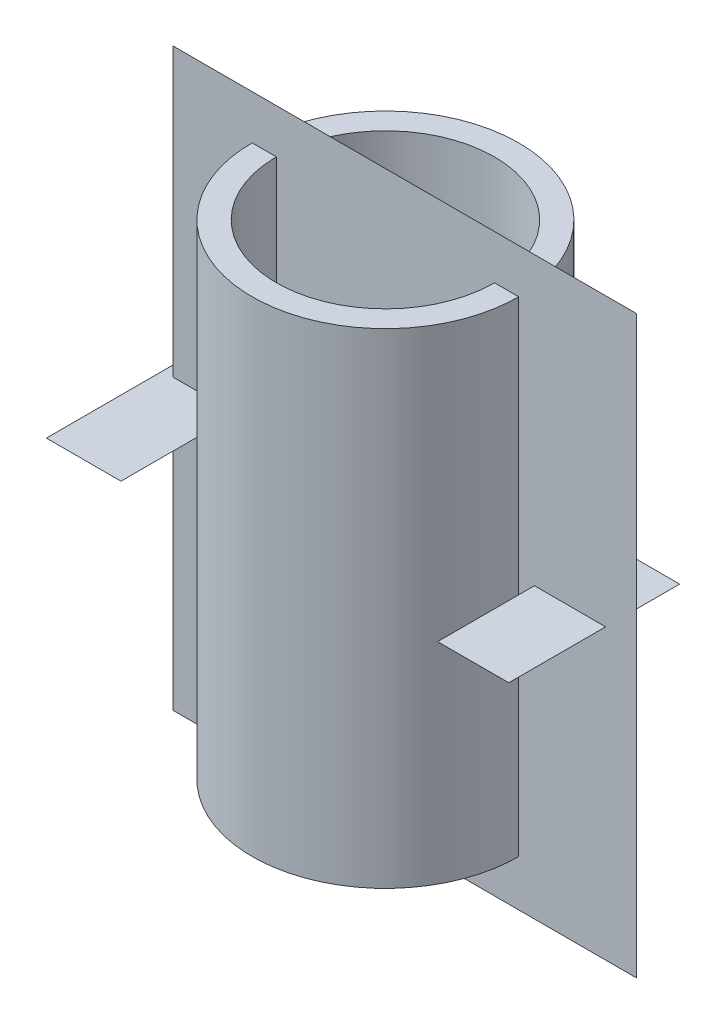
ISO-10303-21;
HEADER;
FILE_DESCRIPTION(('STEP AP214'),'2;1');
FILE_NAME('part.step','',(''),(''),'','','');
FILE_SCHEMA(('AUTOMOTIVE_DESIGN { 1 0 10303 214 1 1 1 1 }'));
ENDSEC;
DATA;
#1=APPLICATION_CONTEXT('core data for automotive mechanical design processes');
#2=APPLICATION_PROTOCOL_DEFINITION('international standard','automotive_design',2000,#1);
#3=PRODUCT_CONTEXT('',#1,'mechanical');
#4=PRODUCT('Part','Part','',(#3));
#5=PRODUCT_RELATED_PRODUCT_CATEGORY('part','',(#4));
#6=PRODUCT_DEFINITION_FORMATION('','',#4);
#7=PRODUCT_DEFINITION_CONTEXT('part definition',#1,'design');
#8=PRODUCT_DEFINITION('design','',#6,#7);
#9=PRODUCT_DEFINITION_SHAPE('','',#8);
#10=(LENGTH_UNIT() NAMED_UNIT(*) SI_UNIT(.MILLI.,.METRE.));
#11=(NAMED_UNIT(*) PLANE_ANGLE_UNIT() SI_UNIT($,.RADIAN.));
#12=(NAMED_UNIT(*) SI_UNIT($,.STERADIAN.) SOLID_ANGLE_UNIT());
#13=UNCERTAINTY_MEASURE_WITH_UNIT(LENGTH_MEASURE(1.E-05),#10,'distance_accuracy_value','');
#14=(GEOMETRIC_REPRESENTATION_CONTEXT(3) GLOBAL_UNCERTAINTY_ASSIGNED_CONTEXT((#13)) GLOBAL_UNIT_ASSIGNED_CONTEXT((#10,
#11,#12)) REPRESENTATION_CONTEXT('',''));
#15=CARTESIAN_POINT('',(0.,0.,0.));
#16=DIRECTION('',(0.,0.,1.));
#17=DIRECTION('',(1.,0.,0.));
#18=AXIS2_PLACEMENT_3D('',#15,#16,#17);
#19=CARTESIAN_POINT('',(0.,0.,0.));
#20=DIRECTION('',(0.,1.,0.));
#21=DIRECTION('',(0.,0.,1.));
#22=AXIS2_PLACEMENT_3D('',#19,#20,#21);
#23=PLANE('',#22);
#24=DIRECTION('',(0.,0.,1.));
#25=VECTOR('',#24,1.);
#26=CARTESIAN_POINT('',(-91.9605176462784,0.,-36.6536783230651));
#27=LINE('',#26,#25);
#28=CARTESIAN_POINT('',(-91.9605176462784,0.,-36.6536783230651));
#29=VERTEX_POINT('',#28);
#30=CARTESIAN_POINT('',(-91.9605176462784,0.,47.9317331917005));
#31=VERTEX_POINT('',#30);
#32=EDGE_CURVE('E79',#29,#31,#27,.T.);
#33=ORIENTED_EDGE('',*,*,#32,.T.);
#34=DIRECTION('',(1.,0.,0.));
#35=VECTOR('',#34,1.);
#36=CARTESIAN_POINT('',(-91.9605176462784,0.,47.9317331917005));
#37=LINE('',#36,#35);
#38=CARTESIAN_POINT('',(-61.1808262339609,0.,47.9317331917005));
#39=VERTEX_POINT('',#38);
#40=EDGE_CURVE('E90',#31,#39,#37,.T.);
#41=ORIENTED_EDGE('',*,*,#40,.T.);
#42=DIRECTION('',(0.,0.,-1.));
#43=VECTOR('',#42,1.);
#44=CARTESIAN_POINT('',(-61.1808262339609,0.,-36.6536783230651));
#45=LINE('',#44,#43);
#46=CARTESIAN_POINT('',(-61.1808262339609,0.,-36.6536783230651));
#47=VERTEX_POINT('',#46);
#48=EDGE_CURVE('E75',#39,#47,#45,.T.);
#49=ORIENTED_EDGE('',*,*,#48,.T.);
#50=DIRECTION('',(-1.,0.,0.));
#51=VECTOR('',#50,1.);
#52=CARTESIAN_POINT('',(-91.9605176462784,0.,-36.6536783230651));
#53=LINE('',#52,#51);
#54=EDGE_CURVE('E14',#47,#29,#53,.T.);
#55=ORIENTED_EDGE('',*,*,#54,.T.);
#56=EDGE_LOOP('',(#33,#41,#49,#55));
#57=FACE_BOUND('',#56,.T.);
#58=ADVANCED_FACE('F70',(#57),#23,.T.);
#59=OPEN_SHELL('',(#58));
#60=SHELL_BASED_SURFACE_MODEL('B2',(#59));
#61=CARTESIAN_POINT('',(0.,0.,0.));
#62=DIRECTION('',(0.,1.,0.));
#63=DIRECTION('',(0.,0.,1.));
#64=AXIS2_PLACEMENT_3D('',#61,#62,#63);
#65=PLANE('',#64);
#66=DIRECTION('',(0.,0.,1.));
#67=VECTOR('',#66,1.);
#68=CARTESIAN_POINT('',(61.4680204624491,0.,-30.5447319358876));
#69=LINE('',#68,#67);
#70=CARTESIAN_POINT('',(61.4680204624491,0.,-30.5447319358876));
#71=VERTEX_POINT('',#70);
#72=CARTESIAN_POINT('',(61.4680204624491,0.,39.9431109930837));
#73=VERTEX_POINT('',#72);
#74=EDGE_CURVE('E133',#71,#73,#69,.T.);
#75=ORIENTED_EDGE('',*,*,#74,.T.);
#76=DIRECTION('',(1.,0.,0.));
#77=VECTOR('',#76,1.);
#78=CARTESIAN_POINT('',(61.4680204624491,0.,39.9431109930837));
#79=LINE('',#78,#77);
#80=CARTESIAN_POINT('',(90.8379550161872,0.,39.9431109930837));
#81=VERTEX_POINT('',#80);
#82=EDGE_CURVE('E144',#73,#81,#79,.T.);
#83=ORIENTED_EDGE('',*,*,#82,.T.);
#84=DIRECTION('',(0.,0.,-1.));
#85=VECTOR('',#84,1.);
#86=CARTESIAN_POINT('',(90.8379550161872,0.,-30.5447319358876));
#87=LINE('',#86,#85);
#88=CARTESIAN_POINT('',(90.8379550161872,0.,-30.5447319358876));
#89=VERTEX_POINT('',#88);
#90=EDGE_CURVE('E129',#81,#89,#87,.T.);
#91=ORIENTED_EDGE('',*,*,#90,.T.);
#92=DIRECTION('',(-1.,0.,0.));
#93=VECTOR('',#92,1.);
#94=CARTESIAN_POINT('',(61.4680204624491,0.,-30.5447319358876));
#95=LINE('',#94,#93);
#96=EDGE_CURVE('E68',#89,#71,#95,.T.);
#97=ORIENTED_EDGE('',*,*,#96,.T.);
#98=EDGE_LOOP('',(#75,#83,#91,#97));
#99=FACE_BOUND('',#98,.T.);
#100=ADVANCED_FACE('F124',(#99),#65,.T.);
#101=OPEN_SHELL('',(#100));
#102=SHELL_BASED_SURFACE_MODEL('B8',(#101));
#103=CARTESIAN_POINT('',(103.619133072208,-119.076130823311,0.));
#104=CARTESIAN_POINT('',(39.8828707405,-119.076130823311,0.));
#105=CARTESIAN_POINT('',(-23.8533915912082,-119.076130823311,0.));
#106=CARTESIAN_POINT('',(-87.5896539229163,-119.076130823311,0.));
#107=CARTESIAN_POINT('',(103.619133072208,-39.9464797847432,0.));
#108=CARTESIAN_POINT('',(39.8828707405,-39.9464797847432,0.));
#109=CARTESIAN_POINT('',(-23.8533915912082,-39.9464797847432,0.));
#110=CARTESIAN_POINT('',(-87.5896539229163,-39.9464797847432,0.));
#111=CARTESIAN_POINT('',(103.619133072208,39.1831712538246,0.));
#112=CARTESIAN_POINT('',(39.8828707405,39.1831712538246,0.));
#113=CARTESIAN_POINT('',(-23.8533915912082,39.1831712538246,0.));
#114=CARTESIAN_POINT('',(-87.5896539229163,39.1831712538246,0.));
#115=CARTESIAN_POINT('',(103.619133072208,118.312822292392,0.));
#116=CARTESIAN_POINT('',(39.8828707405,118.312822292392,0.));
#117=CARTESIAN_POINT('',(-23.8533915912082,118.312822292392,0.));
#118=CARTESIAN_POINT('',(-87.5896539229163,118.312822292392,0.));
#119=B_SPLINE_SURFACE_WITH_KNOTS('',3,3,((#103,#104,#105,#106),(#107,#108,#109,#110),(#111,#112,
#113,#114),(#115,#116,#117,#118)),.UNSPECIFIED.,.F.,.F.,.F.,(4,4),(4,4),(0.,1.),(0.,1.),.UNSPECIFIED.);
#120=CARTESIAN_POINT('',(103.619133072208,-119.076130823311,0.));
#121=CARTESIAN_POINT('',(103.619133072208,-39.9464797847432,0.));
#122=CARTESIAN_POINT('',(103.619133072208,39.1831712538246,0.));
#123=CARTESIAN_POINT('',(103.619133072208,118.312822292392,0.));
#124=B_SPLINE_CURVE_WITH_KNOTS('',3,(#120,#121,#122,#123),.UNSPECIFIED.,.F.,.F.,(4,4),(0.,1.),.UNSPECIFIED.);
#125=CARTESIAN_POINT('',(103.619133072208,-119.076130823311,0.));
#126=VERTEX_POINT('',#125);
#127=CARTESIAN_POINT('',(103.619133072208,118.312822292392,0.));
#128=VERTEX_POINT('',#127);
#129=EDGE_CURVE('E122',#126,#128,#124,.T.);
#130=CARTESIAN_POINT('',(103.619133072208,118.312822292392,0.));
#131=CARTESIAN_POINT('',(39.8828707405,118.312822292392,0.));
#132=CARTESIAN_POINT('',(-23.8533915912082,118.312822292392,0.));
#133=CARTESIAN_POINT('',(-87.5896539229163,118.312822292392,0.));
#134=B_SPLINE_CURVE_WITH_KNOTS('',3,(#130,#131,#132,#133),.UNSPECIFIED.,.F.,.F.,(4,4),(0.,1.),.UNSPECIFIED.);
#135=CARTESIAN_POINT('',(-87.5896539229163,118.312822292392,0.));
#136=VERTEX_POINT('',#135);
#137=EDGE_CURVE('E186',#128,#136,#134,.T.);
#138=CARTESIAN_POINT('',(-87.5896539229163,-119.076130823311,0.));
#139=CARTESIAN_POINT('',(-87.5896539229163,-39.9464797847432,0.));
#140=CARTESIAN_POINT('',(-87.5896539229163,39.1831712538246,0.));
#141=CARTESIAN_POINT('',(-87.5896539229163,118.312822292392,0.));
#142=B_SPLINE_CURVE_WITH_KNOTS('',3,(#138,#139,#140,#141),.UNSPECIFIED.,.F.,.F.,(4,4),(0.,1.),.UNSPECIFIED.);
#143=CARTESIAN_POINT('',(-87.5896539229163,-119.076130823311,0.));
#144=VERTEX_POINT('',#143);
#145=EDGE_CURVE('E194',#136,#144,#142,.F.);
#146=CARTESIAN_POINT('',(103.619133072208,-119.076130823311,0.));
#147=CARTESIAN_POINT('',(39.8828707405,-119.076130823311,0.));
#148=CARTESIAN_POINT('',(-23.8533915912082,-119.076130823311,0.));
#149=CARTESIAN_POINT('',(-87.5896539229163,-119.076130823311,0.));
#150=B_SPLINE_CURVE_WITH_KNOTS('',3,(#146,#147,#148,#149),.UNSPECIFIED.,.F.,.F.,(4,4),(0.,1.),.UNSPECIFIED.);
#151=EDGE_CURVE('E178',#144,#126,#150,.F.);
#152=ORIENTED_EDGE('',*,*,#129,.T.);
#153=ORIENTED_EDGE('',*,*,#137,.T.);
#154=ORIENTED_EDGE('',*,*,#145,.T.);
#155=ORIENTED_EDGE('',*,*,#151,.T.);
#156=EDGE_LOOP('',(#152,#153,#154,#155));
#157=FACE_BOUND('',#156,.T.);
#158=ADVANCED_FACE('F175',(#157),#119,.T.);
#159=OPEN_SHELL('',(#158));
#160=SHELL_BASED_SURFACE_MODEL('B62',(#159));
#161=CARTESIAN_POINT('',(0.,-110.603092707212,0.));
#162=DIRECTION('',(0.,-1.,0.));
#163=DIRECTION('',(0.,0.,-1.));
#164=AXIS2_PLACEMENT_3D('',#161,#162,#163);
#165=CYLINDRICAL_SURFACE('',#164,44.9999999999999);
#166=CARTESIAN_POINT('',(0.,-100.,0.));
#167=DIRECTION('',(0.,-1.,0.));
#168=DIRECTION('',(0.,0.,-1.));
#169=AXIS2_PLACEMENT_3D('',#166,#167,#168);
#170=CIRCLE('',#169,44.9999999999999);
#171=CARTESIAN_POINT('',(0.,-100.,-44.9999999999999));
#172=VERTEX_POINT('',#171);
#173=EDGE_CURVE('E174',#172,#172,#170,.T.);
#174=ORIENTED_EDGE('',*,*,#173,.T.);
#175=EDGE_LOOP('',(#174));
#176=FACE_BOUND('',#175,.T.);
#177=CARTESIAN_POINT('',(0.,100.,0.));
#178=DIRECTION('',(0.,-1.,0.));
#179=DIRECTION('',(0.,0.,-1.));
#180=AXIS2_PLACEMENT_3D('',#177,#178,#179);
#181=CIRCLE('',#180,44.9999999999999);
#182=CARTESIAN_POINT('',(0.,100.,-44.9999999999999));
#183=VERTEX_POINT('',#182);
#184=EDGE_CURVE('E259',#183,#183,#181,.T.);
#185=ORIENTED_EDGE('',*,*,#184,.F.);
#186=EDGE_LOOP('',(#185));
#187=FACE_BOUND('',#186,.T.);
#188=ADVANCED_FACE('F245',(#176,#187),#165,.F.);
#189=CARTESIAN_POINT('',(44.9999999999999,-100.,0.));
#190=DIRECTION('',(0.,-1.,0.));
#191=DIRECTION('',(0.,0.,-1.));
#192=AXIS2_PLACEMENT_3D('',#189,#190,#191);
#193=PLANE('',#192);
#194=CARTESIAN_POINT('',(0.,-100.,0.));
#195=DIRECTION('',(0.,-1.,0.));
#196=DIRECTION('',(0.,0.,-1.));
#197=AXIS2_PLACEMENT_3D('',#194,#195,#196);
#198=CIRCLE('',#197,54.9999999999999);
#199=CARTESIAN_POINT('',(0.,-100.,-54.9999999999999));
#200=VERTEX_POINT('',#199);
#201=EDGE_CURVE('E251',#200,#200,#198,.T.);
#202=ORIENTED_EDGE('',*,*,#201,.T.);
#203=EDGE_LOOP('',(#202));
#204=FACE_BOUND('',#203,.T.);
#205=ORIENTED_EDGE('',*,*,#173,.F.);
#206=EDGE_LOOP('',(#205));
#207=FACE_BOUND('',#206,.T.);
#208=ADVANCED_FACE('F269',(#204,#207),#193,.T.);
#209=CARTESIAN_POINT('',(0.,-110.603092707212,0.));
#210=DIRECTION('',(0.,-1.,0.));
#211=DIRECTION('',(0.,0.,-1.));
#212=AXIS2_PLACEMENT_3D('',#209,#210,#211);
#213=CYLINDRICAL_SURFACE('',#212,54.9999999999999);
#214=CARTESIAN_POINT('',(0.,100.,0.));
#215=DIRECTION('',(0.,-1.,0.));
#216=DIRECTION('',(0.,0.,-1.));
#217=AXIS2_PLACEMENT_3D('',#214,#215,#216);
#218=CIRCLE('',#217,54.9999999999999);
#219=CARTESIAN_POINT('',(0.,100.,-54.9999999999999));
#220=VERTEX_POINT('',#219);
#221=EDGE_CURVE('E255',#220,#220,#218,.T.);
#222=ORIENTED_EDGE('',*,*,#221,.T.);
#223=EDGE_LOOP('',(#222));
#224=FACE_BOUND('',#223,.T.);
#225=ORIENTED_EDGE('',*,*,#201,.F.);
#226=EDGE_LOOP('',(#225));
#227=FACE_BOUND('',#226,.T.);
#228=ADVANCED_FACE('F273',(#224,#227),#213,.T.);
#229=CARTESIAN_POINT('',(44.9999999999999,100.,0.));
#230=DIRECTION('',(0.,1.,0.));
#231=DIRECTION('',(0.,0.,1.));
#232=AXIS2_PLACEMENT_3D('',#229,#230,#231);
#233=PLANE('',#232);
#234=ORIENTED_EDGE('',*,*,#184,.T.);
#235=EDGE_LOOP('',(#234));
#236=FACE_BOUND('',#235,.T.);
#237=ORIENTED_EDGE('',*,*,#221,.F.);
#238=EDGE_LOOP('',(#237));
#239=FACE_BOUND('',#238,.T.);
#240=ADVANCED_FACE('F265',(#236,#239),#233,.T.);
#241=CLOSED_SHELL('',(#188,#208,#228,#240));
#242=MANIFOLD_SOLID_BREP('B116',#241);
#243=ADVANCED_BREP_SHAPE_REPRESENTATION('',(#18,#242),#14);
#244=MANIFOLD_SURFACE_SHAPE_REPRESENTATION('',(#18,#60,#102,#160),#14);
#245=SHAPE_REPRESENTATION('',(#18),#14);
#246=SHAPE_DEFINITION_REPRESENTATION(#9,#245);
#247=SHAPE_REPRESENTATION_RELATIONSHIP('','',#245,#243);
#248=SHAPE_REPRESENTATION_RELATIONSHIP('','',#245,#244);
ENDSEC;
END-ISO-10303-21;
